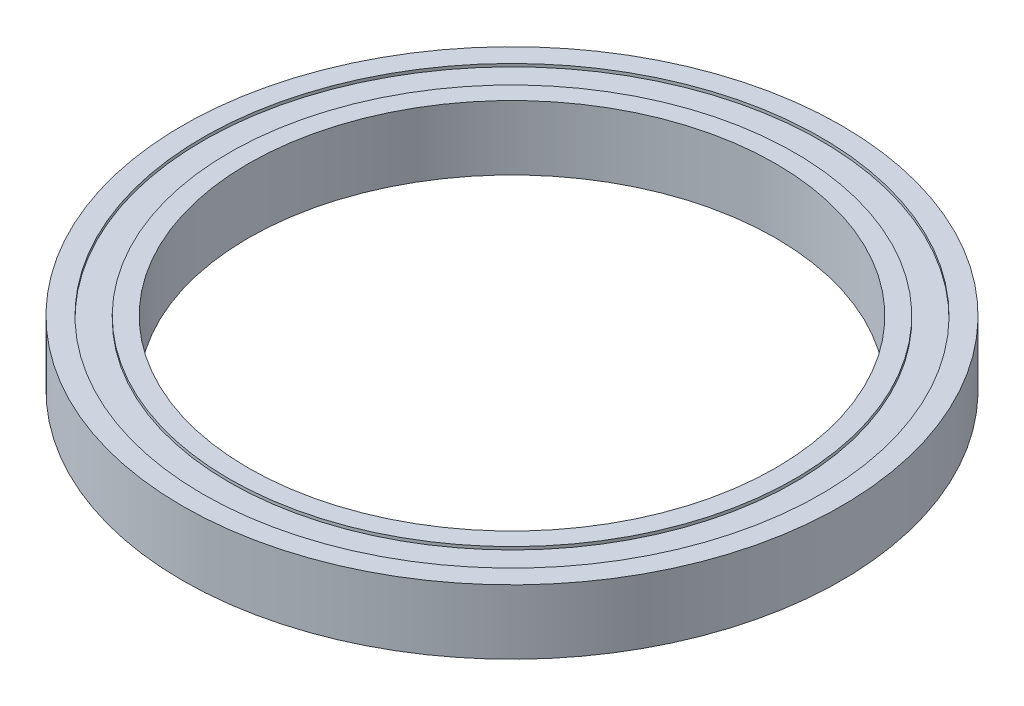
ISO-10303-21;
HEADER;
FILE_DESCRIPTION(('STEP AP214'),'2;1');
FILE_NAME('part.step','',(''),(''),'','','');
FILE_SCHEMA(('AUTOMOTIVE_DESIGN { 1 0 10303 214 1 1 1 1 }'));
ENDSEC;
DATA;
#1=APPLICATION_CONTEXT('core data for automotive mechanical design processes');
#2=APPLICATION_PROTOCOL_DEFINITION('international standard','automotive_design',2000,#1);
#3=PRODUCT_CONTEXT('',#1,'mechanical');
#4=PRODUCT('Part','Part','',(#3));
#5=PRODUCT_RELATED_PRODUCT_CATEGORY('part','',(#4));
#6=PRODUCT_DEFINITION_FORMATION('','',#4);
#7=PRODUCT_DEFINITION_CONTEXT('part definition',#1,'design');
#8=PRODUCT_DEFINITION('design','',#6,#7);
#9=PRODUCT_DEFINITION_SHAPE('','',#8);
#10=(LENGTH_UNIT() NAMED_UNIT(*) SI_UNIT(.MILLI.,.METRE.));
#11=(NAMED_UNIT(*) PLANE_ANGLE_UNIT() SI_UNIT($,.RADIAN.));
#12=(NAMED_UNIT(*) SI_UNIT($,.STERADIAN.) SOLID_ANGLE_UNIT());
#13=UNCERTAINTY_MEASURE_WITH_UNIT(LENGTH_MEASURE(1.E-05),#10,'distance_accuracy_value','');
#14=(GEOMETRIC_REPRESENTATION_CONTEXT(3) GLOBAL_UNCERTAINTY_ASSIGNED_CONTEXT((#13)) GLOBAL_UNIT_ASSIGNED_CONTEXT((#10,
#11,#12)) REPRESENTATION_CONTEXT('',''));
#15=CARTESIAN_POINT('',(0.,0.,0.));
#16=DIRECTION('',(0.,0.,1.));
#17=DIRECTION('',(1.,0.,0.));
#18=AXIS2_PLACEMENT_3D('',#15,#16,#17);
#19=CARTESIAN_POINT('',(0.,0.,0.));
#20=DIRECTION('',(0.,1.,0.));
#21=DIRECTION('',(0.,0.,1.));
#22=AXIS2_PLACEMENT_3D('',#19,#20,#21);
#23=PLANE('',#22);
#24=CARTESIAN_POINT('',(0.,0.,0.));
#25=DIRECTION('',(0.,1.,0.));
#26=DIRECTION('',(0.,0.,1.));
#27=AXIS2_PLACEMENT_3D('',#24,#25,#26);
#28=CIRCLE('',#27,112.5);
#29=CARTESIAN_POINT('',(0.,0.,112.5));
#30=VERTEX_POINT('',#29);
#31=EDGE_CURVE('E19',#30,#30,#28,.T.);
#32=ORIENTED_EDGE('',*,*,#31,.F.);
#33=EDGE_LOOP('',(#32));
#34=FACE_BOUND('',#33,.T.);
#35=CARTESIAN_POINT('',(0.,0.,0.));
#36=DIRECTION('',(0.,1.,0.));
#37=DIRECTION('',(0.,0.,1.));
#38=AXIS2_PLACEMENT_3D('',#35,#36,#37);
#39=CIRCLE('',#38,105.5);
#40=CARTESIAN_POINT('',(0.,0.,105.5));
#41=VERTEX_POINT('',#40);
#42=EDGE_CURVE('E46',#41,#41,#39,.T.);
#43=ORIENTED_EDGE('',*,*,#42,.T.);
#44=EDGE_LOOP('',(#43));
#45=FACE_BOUND('',#44,.T.);
#46=ADVANCED_FACE('F15',(#34,#45),#23,.F.);
#47=CARTESIAN_POINT('',(0.,22.,0.));
#48=DIRECTION('',(0.,1.,0.));
#49=DIRECTION('',(0.,0.,1.));
#50=AXIS2_PLACEMENT_3D('',#47,#48,#49);
#51=PLANE('',#50);
#52=CARTESIAN_POINT('',(0.,22.,0.));
#53=DIRECTION('',(0.,1.,0.));
#54=DIRECTION('',(0.,0.,1.));
#55=AXIS2_PLACEMENT_3D('',#52,#53,#54);
#56=CIRCLE('',#55,90.);
#57=CARTESIAN_POINT('',(0.,22.,90.));
#58=VERTEX_POINT('',#57);
#59=EDGE_CURVE('E26',#58,#58,#56,.T.);
#60=ORIENTED_EDGE('',*,*,#59,.F.);
#61=EDGE_LOOP('',(#60));
#62=FACE_BOUND('',#61,.T.);
#63=CARTESIAN_POINT('',(0.,22.,0.));
#64=DIRECTION('',(0.,1.,0.));
#65=DIRECTION('',(0.,0.,1.));
#66=AXIS2_PLACEMENT_3D('',#63,#64,#65);
#67=CIRCLE('',#66,96.5);
#68=CARTESIAN_POINT('',(0.,22.,96.5));
#69=VERTEX_POINT('',#68);
#70=EDGE_CURVE('E40',#69,#69,#67,.T.);
#71=ORIENTED_EDGE('',*,*,#70,.T.);
#72=EDGE_LOOP('',(#71));
#73=FACE_BOUND('',#72,.T.);
#74=ADVANCED_FACE('F90',(#62,#73),#51,.T.);
#75=CARTESIAN_POINT('',(0.,22.,0.));
#76=DIRECTION('',(0.,1.,0.));
#77=DIRECTION('',(0.,0.,1.));
#78=AXIS2_PLACEMENT_3D('',#75,#76,#77);
#79=CIRCLE('',#78,105.5);
#80=CARTESIAN_POINT('',(0.,22.,105.5));
#81=VERTEX_POINT('',#80);
#82=EDGE_CURVE('E34',#81,#81,#79,.T.);
#83=ORIENTED_EDGE('',*,*,#82,.F.);
#84=EDGE_LOOP('',(#83));
#85=FACE_BOUND('',#84,.T.);
#86=CARTESIAN_POINT('',(0.,22.,0.));
#87=DIRECTION('',(0.,1.,0.));
#88=DIRECTION('',(0.,0.,1.));
#89=AXIS2_PLACEMENT_3D('',#86,#87,#88);
#90=CIRCLE('',#89,112.5);
#91=CARTESIAN_POINT('',(0.,22.,112.5));
#92=VERTEX_POINT('',#91);
#93=EDGE_CURVE('E10',#92,#92,#90,.T.);
#94=ORIENTED_EDGE('',*,*,#93,.T.);
#95=EDGE_LOOP('',(#94));
#96=FACE_BOUND('',#95,.T.);
#97=ADVANCED_FACE('F70',(#85,#96),#51,.T.);
#98=CARTESIAN_POINT('',(0.,0.,0.));
#99=DIRECTION('',(0.,1.,0.));
#100=DIRECTION('',(0.,0.,1.));
#101=AXIS2_PLACEMENT_3D('',#98,#99,#100);
#102=CIRCLE('',#101,96.5);
#103=CARTESIAN_POINT('',(0.,0.,96.5));
#104=VERTEX_POINT('',#103);
#105=EDGE_CURVE('E52',#104,#104,#102,.T.);
#106=ORIENTED_EDGE('',*,*,#105,.F.);
#107=EDGE_LOOP('',(#106));
#108=FACE_BOUND('',#107,.T.);
#109=CARTESIAN_POINT('',(0.,0.,0.));
#110=DIRECTION('',(0.,1.,0.));
#111=DIRECTION('',(0.,0.,1.));
#112=AXIS2_PLACEMENT_3D('',#109,#110,#111);
#113=CIRCLE('',#112,90.);
#114=CARTESIAN_POINT('',(0.,0.,90.));
#115=VERTEX_POINT('',#114);
#116=EDGE_CURVE('E28',#115,#115,#113,.T.);
#117=ORIENTED_EDGE('',*,*,#116,.T.);
#118=EDGE_LOOP('',(#117));
#119=FACE_BOUND('',#118,.T.);
#120=ADVANCED_FACE('F67',(#108,#119),#23,.F.);
#121=CARTESIAN_POINT('',(0.,22.,0.));
#122=DIRECTION('',(0.,-1.,0.));
#123=DIRECTION('',(0.,0.,-1.));
#124=AXIS2_PLACEMENT_3D('',#121,#122,#123);
#125=CYLINDRICAL_SURFACE('',#124,112.5);
#126=ORIENTED_EDGE('',*,*,#93,.F.);
#127=EDGE_LOOP('',(#126));
#128=FACE_BOUND('',#127,.T.);
#129=ORIENTED_EDGE('',*,*,#31,.T.);
#130=EDGE_LOOP('',(#129));
#131=FACE_BOUND('',#130,.T.);
#132=ADVANCED_FACE('F17',(#128,#131),#125,.T.);
#133=CARTESIAN_POINT('',(0.,22.,0.));
#134=DIRECTION('',(0.,-1.,0.));
#135=DIRECTION('',(0.,0.,-1.));
#136=AXIS2_PLACEMENT_3D('',#133,#134,#135);
#137=CYLINDRICAL_SURFACE('',#136,90.);
#138=ORIENTED_EDGE('',*,*,#59,.T.);
#139=EDGE_LOOP('',(#138));
#140=FACE_BOUND('',#139,.T.);
#141=ORIENTED_EDGE('',*,*,#116,.F.);
#142=EDGE_LOOP('',(#141));
#143=FACE_BOUND('',#142,.T.);
#144=ADVANCED_FACE('F73',(#140,#143),#137,.F.);
#145=CARTESIAN_POINT('',(0.,21.,0.));
#146=DIRECTION('',(0.,1.,0.));
#147=DIRECTION('',(0.,0.,1.));
#148=AXIS2_PLACEMENT_3D('',#145,#146,#147);
#149=CYLINDRICAL_SURFACE('',#148,105.5);
#150=CARTESIAN_POINT('',(0.,21.,0.));
#151=DIRECTION('',(0.,1.,0.));
#152=DIRECTION('',(0.,0.,1.));
#153=AXIS2_PLACEMENT_3D('',#150,#151,#152);
#154=CIRCLE('',#153,105.5);
#155=CARTESIAN_POINT('',(0.,21.,105.5));
#156=VERTEX_POINT('',#155);
#157=EDGE_CURVE('E31',#156,#156,#154,.T.);
#158=ORIENTED_EDGE('',*,*,#157,.F.);
#159=EDGE_LOOP('',(#158));
#160=FACE_BOUND('',#159,.T.);
#161=ORIENTED_EDGE('',*,*,#82,.T.);
#162=EDGE_LOOP('',(#161));
#163=FACE_BOUND('',#162,.T.);
#164=ADVANCED_FACE('F75',(#160,#163),#149,.F.);
#165=CARTESIAN_POINT('',(0.,21.,0.));
#166=DIRECTION('',(0.,1.,0.));
#167=DIRECTION('',(0.,0.,1.));
#168=AXIS2_PLACEMENT_3D('',#165,#166,#167);
#169=PLANE('',#168);
#170=CARTESIAN_POINT('',(0.,21.,0.));
#171=DIRECTION('',(0.,1.,0.));
#172=DIRECTION('',(0.,0.,1.));
#173=AXIS2_PLACEMENT_3D('',#170,#171,#172);
#174=CIRCLE('',#173,96.5);
#175=CARTESIAN_POINT('',(0.,21.,96.5));
#176=VERTEX_POINT('',#175);
#177=EDGE_CURVE('E37',#176,#176,#174,.T.);
#178=ORIENTED_EDGE('',*,*,#177,.F.);
#179=EDGE_LOOP('',(#178));
#180=FACE_BOUND('',#179,.T.);
#181=ORIENTED_EDGE('',*,*,#157,.T.);
#182=EDGE_LOOP('',(#181));
#183=FACE_BOUND('',#182,.T.);
#184=ADVANCED_FACE('F84',(#180,#183),#169,.T.);
#185=CARTESIAN_POINT('',(0.,21.,0.));
#186=DIRECTION('',(0.,1.,0.));
#187=DIRECTION('',(0.,0.,1.));
#188=AXIS2_PLACEMENT_3D('',#185,#186,#187);
#189=CYLINDRICAL_SURFACE('',#188,96.5);
#190=ORIENTED_EDGE('',*,*,#177,.T.);
#191=EDGE_LOOP('',(#190));
#192=FACE_BOUND('',#191,.T.);
#193=ORIENTED_EDGE('',*,*,#70,.F.);
#194=EDGE_LOOP('',(#193));
#195=FACE_BOUND('',#194,.T.);
#196=ADVANCED_FACE('F142',(#192,#195),#189,.T.);
#197=CARTESIAN_POINT('',(0.,1.,0.));
#198=DIRECTION('',(0.,-1.,0.));
#199=DIRECTION('',(0.,0.,1.));
#200=AXIS2_PLACEMENT_3D('',#197,#198,#199);
#201=PLANE('',#200);
#202=CARTESIAN_POINT('',(0.,1.,0.));
#203=DIRECTION('',(0.,1.,0.));
#204=DIRECTION('',(0.,0.,1.));
#205=AXIS2_PLACEMENT_3D('',#202,#203,#204);
#206=CIRCLE('',#205,105.5);
#207=CARTESIAN_POINT('',(0.,1.,105.5));
#208=VERTEX_POINT('',#207);
#209=EDGE_CURVE('E43',#208,#208,#206,.T.);
#210=ORIENTED_EDGE('',*,*,#209,.F.);
#211=EDGE_LOOP('',(#210));
#212=FACE_BOUND('',#211,.T.);
#213=CARTESIAN_POINT('',(0.,1.,0.));
#214=DIRECTION('',(0.,1.,0.));
#215=DIRECTION('',(0.,0.,1.));
#216=AXIS2_PLACEMENT_3D('',#213,#214,#215);
#217=CIRCLE('',#216,96.5);
#218=CARTESIAN_POINT('',(0.,1.,96.5));
#219=VERTEX_POINT('',#218);
#220=EDGE_CURVE('E49',#219,#219,#217,.T.);
#221=ORIENTED_EDGE('',*,*,#220,.T.);
#222=EDGE_LOOP('',(#221));
#223=FACE_BOUND('',#222,.T.);
#224=ADVANCED_FACE('F58',(#212,#223),#201,.T.);
#225=CARTESIAN_POINT('',(0.,1.,0.));
#226=DIRECTION('',(0.,-1.,0.));
#227=DIRECTION('',(0.,0.,-1.));
#228=AXIS2_PLACEMENT_3D('',#225,#226,#227);
#229=CYLINDRICAL_SURFACE('',#228,105.5);
#230=ORIENTED_EDGE('',*,*,#209,.T.);
#231=EDGE_LOOP('',(#230));
#232=FACE_BOUND('',#231,.T.);
#233=ORIENTED_EDGE('',*,*,#42,.F.);
#234=EDGE_LOOP('',(#233));
#235=FACE_BOUND('',#234,.T.);
#236=ADVANCED_FACE('F63',(#232,#235),#229,.F.);
#237=CARTESIAN_POINT('',(0.,1.,0.));
#238=DIRECTION('',(0.,-1.,0.));
#239=DIRECTION('',(0.,0.,-1.));
#240=AXIS2_PLACEMENT_3D('',#237,#238,#239);
#241=CYLINDRICAL_SURFACE('',#240,96.5);
#242=ORIENTED_EDGE('',*,*,#220,.F.);
#243=EDGE_LOOP('',(#242));
#244=FACE_BOUND('',#243,.T.);
#245=ORIENTED_EDGE('',*,*,#105,.T.);
#246=EDGE_LOOP('',(#245));
#247=FACE_BOUND('',#246,.T.);
#248=ADVANCED_FACE('F60',(#244,#247),#241,.T.);
#249=CLOSED_SHELL('',(#46,#74,#97,#120,#132,#144,#164,#184,#196,#224,#236,#248));
#250=MANIFOLD_SOLID_BREP('B1',#249);
#251=ADVANCED_BREP_SHAPE_REPRESENTATION('',(#18,#250),#14);
#252=SHAPE_DEFINITION_REPRESENTATION(#9,#251);
ENDSEC;
END-ISO-10303-21;
